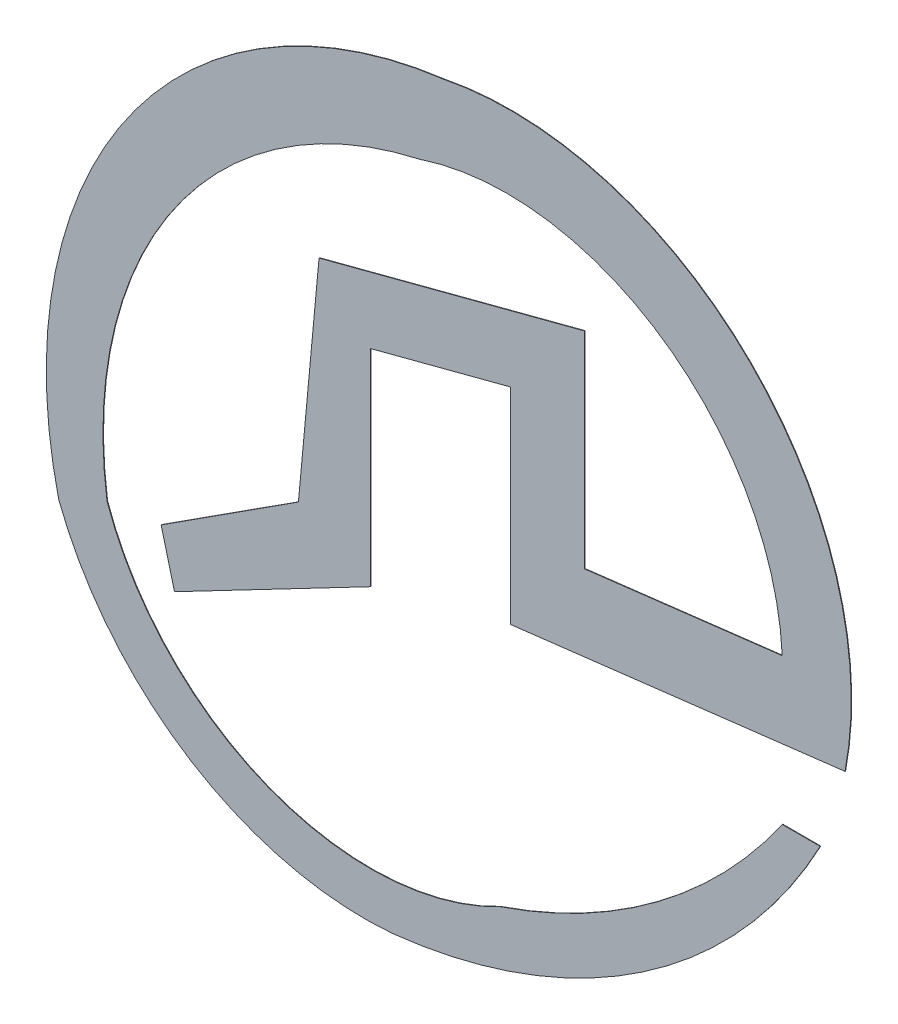
ISO-10303-21;
HEADER;
FILE_DESCRIPTION(('STEP AP214'),'2;1');
FILE_NAME('part.step','',(''),(''),'','','');
FILE_SCHEMA(('AUTOMOTIVE_DESIGN { 1 0 10303 214 1 1 1 1 }'));
ENDSEC;
DATA;
#1=APPLICATION_CONTEXT('core data for automotive mechanical design processes');
#2=APPLICATION_PROTOCOL_DEFINITION('international standard','automotive_design',2000,#1);
#3=PRODUCT_CONTEXT('',#1,'mechanical');
#4=PRODUCT('Part','Part','',(#3));
#5=PRODUCT_RELATED_PRODUCT_CATEGORY('part','',(#4));
#6=PRODUCT_DEFINITION_FORMATION('','',#4);
#7=PRODUCT_DEFINITION_CONTEXT('part definition',#1,'design');
#8=PRODUCT_DEFINITION('design','',#6,#7);
#9=PRODUCT_DEFINITION_SHAPE('','',#8);
#10=(LENGTH_UNIT() NAMED_UNIT(*) SI_UNIT(.MILLI.,.METRE.));
#11=(NAMED_UNIT(*) PLANE_ANGLE_UNIT() SI_UNIT($,.RADIAN.));
#12=(NAMED_UNIT(*) SI_UNIT($,.STERADIAN.) SOLID_ANGLE_UNIT());
#13=UNCERTAINTY_MEASURE_WITH_UNIT(LENGTH_MEASURE(1.E-05),#10,'distance_accuracy_value','');
#14=(GEOMETRIC_REPRESENTATION_CONTEXT(3) GLOBAL_UNCERTAINTY_ASSIGNED_CONTEXT((#13)) GLOBAL_UNIT_ASSIGNED_CONTEXT((#10,
#11,#12)) REPRESENTATION_CONTEXT('',''));
#15=CARTESIAN_POINT('',(0.,0.,0.));
#16=DIRECTION('',(0.,0.,1.));
#17=DIRECTION('',(1.,0.,0.));
#18=AXIS2_PLACEMENT_3D('',#15,#16,#17);
#19=CARTESIAN_POINT('',(-8.12755086725817,5.06390768085549,0.));
#20=DIRECTION('',(0.,0.,1.));
#21=DIRECTION('',(-0.823009518769598,0.56802758032919,0.));
#22=AXIS2_PLACEMENT_3D('',#19,#20,#21);
#23=CYLINDRICAL_SURFACE('',#22,0.740215120586796);
#24=DIRECTION('',(0.,0.,1.));
#25=VECTOR('',#24,1.);
#26=CARTESIAN_POINT('',(-8.86017256024353,4.95815381703683,0.));
#27=LINE('',#26,#25);
#28=CARTESIAN_POINT('',(-8.86017256024353,4.95815381703683,0.));
#29=VERTEX_POINT('',#28);
#30=CARTESIAN_POINT('',(-8.86017256024353,4.95815381703683,0.001));
#31=VERTEX_POINT('',#30);
#32=EDGE_CURVE('E11',#29,#31,#27,.T.);
#33=ORIENTED_EDGE('',*,*,#32,.F.);
#34=CARTESIAN_POINT('',(-8.12755086725852,5.06390768085558,0.));
#35=DIRECTION('',(0.,0.,-1.));
#36=DIRECTION('',(-0.217470441221157,0.976066907130385,0.));
#37=AXIS2_PLACEMENT_3D('',#34,#35,#36);
#38=CIRCLE('',#37,0.740215120586452);
#39=CARTESIAN_POINT('',(-8.28852577613103,5.78640716421755,0.));
#40=VERTEX_POINT('',#39);
#41=EDGE_CURVE('E24',#29,#40,#38,.T.);
#42=ORIENTED_EDGE('',*,*,#41,.T.);
#43=DIRECTION('',(0.,0.,1.));
#44=VECTOR('',#43,1.);
#45=CARTESIAN_POINT('',(-8.28852577613103,5.78640716421755,0.));
#46=LINE('',#45,#44);
#47=CARTESIAN_POINT('',(-8.28852577613103,5.78640716421755,0.001));
#48=VERTEX_POINT('',#47);
#49=EDGE_CURVE('E328',#40,#48,#46,.T.);
#50=ORIENTED_EDGE('',*,*,#49,.T.);
#51=CARTESIAN_POINT('',(-8.12755086725852,5.06390768085558,0.001));
#52=DIRECTION('',(0.,0.,-1.));
#53=DIRECTION('',(-0.217470441221157,0.976066907130385,0.));
#54=AXIS2_PLACEMENT_3D('',#51,#52,#53);
#55=CIRCLE('',#54,0.740215120586452);
#56=EDGE_CURVE('E37',#31,#48,#55,.T.);
#57=ORIENTED_EDGE('',*,*,#56,.F.);
#58=EDGE_LOOP('',(#33,#42,#50,#57));
#59=FACE_BOUND('',#58,.T.);
#60=ADVANCED_FACE('F17',(#59),#23,.F.);
#61=CARTESIAN_POINT('',(-8.37801070213537,5.12812845671001,0.));
#62=DIRECTION('',(0.,0.,1.));
#63=DIRECTION('',(-0.365842136993649,-0.930676920740984,0.));
#64=AXIS2_PLACEMENT_3D('',#61,#62,#63);
#65=CYLINDRICAL_SURFACE('',#64,0.511244985839821);
#66=DIRECTION('',(0.,0.,1.));
#67=VECTOR('',#66,1.);
#68=CARTESIAN_POINT('',(-8.14066059665703,4.67531904539405,0.));
#69=LINE('',#68,#67);
#70=CARTESIAN_POINT('',(-8.14066059665703,4.67531904539405,0.));
#71=VERTEX_POINT('',#70);
#72=CARTESIAN_POINT('',(-8.14066059665703,4.67531904539405,0.001));
#73=VERTEX_POINT('',#72);
#74=EDGE_CURVE('E324',#71,#73,#69,.T.);
#75=ORIENTED_EDGE('',*,*,#74,.F.);
#76=CARTESIAN_POINT('',(-8.37801070213478,5.12812845671054,0.));
#77=DIRECTION('',(0.,0.,-1.));
#78=DIRECTION('',(-0.943113128661843,-0.332471993626034,0.));
#79=AXIS2_PLACEMENT_3D('',#76,#77,#78);
#80=CIRCLE('',#79,0.511244985840538);
#81=EDGE_CURVE('E321',#71,#29,#80,.T.);
#82=ORIENTED_EDGE('',*,*,#81,.T.);
#83=ORIENTED_EDGE('',*,*,#32,.T.);
#84=CARTESIAN_POINT('',(-8.37801070213478,5.12812845671054,0.001));
#85=DIRECTION('',(0.,0.,-1.));
#86=DIRECTION('',(-0.943113128661843,-0.332471993626034,0.));
#87=AXIS2_PLACEMENT_3D('',#84,#85,#86);
#88=CIRCLE('',#87,0.511244985840538);
#89=EDGE_CURVE('E319',#73,#31,#88,.T.);
#90=ORIENTED_EDGE('',*,*,#89,.F.);
#91=EDGE_LOOP('',(#75,#82,#83,#90));
#92=FACE_BOUND('',#91,.T.);
#93=ADVANCED_FACE('F379',(#92),#65,.F.);
#94=CARTESIAN_POINT('',(-8.47218859026643,5.65324933373102,0.));
#95=DIRECTION('',(0.,0.,1.));
#96=DIRECTION('',(0.601295969111747,-0.799026380997502,0.));
#97=AXIS2_PLACEMENT_3D('',#94,#95,#96);
#98=CYLINDRICAL_SURFACE('',#97,1.03259791758141);
#99=DIRECTION('',(0.,0.,1.));
#100=VECTOR('',#99,1.);
#101=CARTESIAN_POINT('',(-7.62428831571753,5.06390768085605,0.));
#102=LINE('',#101,#100);
#103=CARTESIAN_POINT('',(-7.62428831571753,5.06390768085605,0.));
#104=VERTEX_POINT('',#103);
#105=CARTESIAN_POINT('',(-7.62428831571753,5.06390768085605,0.001));
#106=VERTEX_POINT('',#105);
#107=EDGE_CURVE('E316',#104,#106,#102,.T.);
#108=ORIENTED_EDGE('',*,*,#107,.F.);
#109=CARTESIAN_POINT('',(-8.47218859026663,5.65324933373129,0.));
#110=DIRECTION('',(0.,0.,-1.));
#111=DIRECTION('',(0.321062039700811,-0.947058164350614,0.));
#112=AXIS2_PLACEMENT_3D('',#109,#110,#111);
#113=CIRCLE('',#112,1.03259791758175);
#114=EDGE_CURVE('E313',#104,#71,#113,.T.);
#115=ORIENTED_EDGE('',*,*,#114,.T.);
#116=ORIENTED_EDGE('',*,*,#74,.T.);
#117=CARTESIAN_POINT('',(-8.47218859026663,5.65324933373129,0.000999999999999997));
#118=DIRECTION('',(0.,0.,-1.));
#119=DIRECTION('',(0.321062039700811,-0.947058164350614,0.));
#120=AXIS2_PLACEMENT_3D('',#117,#118,#119);
#121=CIRCLE('',#120,1.03259791758175);
#122=EDGE_CURVE('E310',#106,#73,#121,.T.);
#123=ORIENTED_EDGE('',*,*,#122,.F.);
#124=EDGE_LOOP('',(#108,#115,#116,#123));
#125=FACE_BOUND('',#124,.T.);
#126=ADVANCED_FACE('F376',(#125),#98,.F.);
#127=CARTESIAN_POINT('',(-7.58951099048478,5.06390768085605,0.));
#128=DIRECTION('',(0.,1.,0.));
#129=DIRECTION('',(0.,0.,1.));
#130=AXIS2_PLACEMENT_3D('',#127,#128,#129);
#131=PLANE('',#130);
#132=DIRECTION('',(-1.,0.,0.));
#133=VECTOR('',#132,1.);
#134=CARTESIAN_POINT('',(-7.55473366525203,5.06390768085605,0.));
#135=LINE('',#134,#133);
#136=CARTESIAN_POINT('',(-7.55473366525203,5.06390768085605,0.));
#137=VERTEX_POINT('',#136);
#138=EDGE_CURVE('E307',#137,#104,#135,.T.);
#139=ORIENTED_EDGE('',*,*,#138,.T.);
#140=ORIENTED_EDGE('',*,*,#107,.T.);
#141=DIRECTION('',(-1.,0.,0.));
#142=VECTOR('',#141,1.);
#143=CARTESIAN_POINT('',(-7.55473366525203,5.06390768085605,0.001));
#144=LINE('',#143,#142);
#145=CARTESIAN_POINT('',(-7.55473366525203,5.06390768085605,0.001));
#146=VERTEX_POINT('',#145);
#147=EDGE_CURVE('E304',#146,#106,#144,.T.);
#148=ORIENTED_EDGE('',*,*,#147,.F.);
#149=DIRECTION('',(0.,0.,1.));
#150=VECTOR('',#149,1.);
#151=CARTESIAN_POINT('',(-7.55473366525203,5.06390768085605,0.));
#152=LINE('',#151,#150);
#153=EDGE_CURVE('E301',#137,#146,#152,.T.);
#154=ORIENTED_EDGE('',*,*,#153,.F.);
#155=EDGE_LOOP('',(#139,#140,#148,#154));
#156=FACE_BOUND('',#155,.T.);
#157=ADVANCED_FACE('F373',(#156),#131,.T.);
#158=CARTESIAN_POINT('',(-8.4458952838809,5.5378732251417,0.));
#159=DIRECTION('',(0.,0.,1.));
#160=DIRECTION('',(0.560614155361485,-0.828077151483078,0.));
#161=AXIS2_PLACEMENT_3D('',#158,#159,#160);
#162=CYLINDRICAL_SURFACE('',#161,1.00936235697931);
#163=CARTESIAN_POINT('',(-8.4458952838811,5.53787322514245,0.));
#164=DIRECTION('',(0.,0.,1.));
#165=DIRECTION('',(0.882895634522556,-0.469569269161658,0.));
#166=AXIS2_PLACEMENT_3D('',#163,#164,#165);
#167=CIRCLE('',#166,1.00936235698004);
#168=CARTESIAN_POINT('',(-8.33683395507003,4.53442018974605,0.));
#169=VERTEX_POINT('',#168);
#170=EDGE_CURVE('E298',#169,#137,#167,.T.);
#171=ORIENTED_EDGE('',*,*,#170,.T.);
#172=ORIENTED_EDGE('',*,*,#153,.T.);
#173=CARTESIAN_POINT('',(-8.4458952838811,5.53787322514245,0.001));
#174=DIRECTION('',(0.,0.,1.));
#175=DIRECTION('',(0.882895634522556,-0.469569269161658,0.));
#176=AXIS2_PLACEMENT_3D('',#173,#174,#175);
#177=CIRCLE('',#176,1.00936235698004);
#178=CARTESIAN_POINT('',(-8.33683395507003,4.53442018974605,0.001));
#179=VERTEX_POINT('',#178);
#180=EDGE_CURVE('E295',#179,#146,#177,.T.);
#181=ORIENTED_EDGE('',*,*,#180,.F.);
#182=DIRECTION('',(0.,0.,1.));
#183=VECTOR('',#182,1.);
#184=CARTESIAN_POINT('',(-8.33683395507003,4.53442018974605,0.));
#185=LINE('',#184,#183);
#186=EDGE_CURVE('E292',#169,#179,#185,.T.);
#187=ORIENTED_EDGE('',*,*,#186,.F.);
#188=EDGE_LOOP('',(#171,#172,#181,#187));
#189=FACE_BOUND('',#188,.T.);
#190=ADVANCED_FACE('F370',(#189),#162,.T.);
#191=CARTESIAN_POINT('',(-8.38869511225856,5.13218509250382,0.));
#192=DIRECTION('',(0.,0.,1.));
#193=DIRECTION('',(-0.529998941108192,-0.847998303314456,0.));
#194=AXIS2_PLACEMENT_3D('',#191,#192,#193);
#195=CYLINDRICAL_SURFACE('',#194,0.600010382072117);
#196=CARTESIAN_POINT('',(-8.38869511225918,5.1321850925034,0.));
#197=DIRECTION('',(0.,0.,1.));
#198=DIRECTION('',(0.0864337663793568,-0.996257599232989,0.));
#199=AXIS2_PLACEMENT_3D('',#196,#197,#198);
#200=CIRCLE('',#199,0.600010382071433);
#201=CARTESIAN_POINT('',(-8.94873755496603,4.91685994078988,0.));
#202=VERTEX_POINT('',#201);
#203=EDGE_CURVE('E289',#202,#169,#200,.T.);
#204=ORIENTED_EDGE('',*,*,#203,.T.);
#205=ORIENTED_EDGE('',*,*,#186,.T.);
#206=CARTESIAN_POINT('',(-8.38869511225918,5.1321850925034,0.001));
#207=DIRECTION('',(0.,0.,1.));
#208=DIRECTION('',(0.0864337663793568,-0.996257599232989,0.));
#209=AXIS2_PLACEMENT_3D('',#206,#207,#208);
#210=CIRCLE('',#209,0.600010382071433);
#211=CARTESIAN_POINT('',(-8.94873755496603,4.91685994078988,0.001));
#212=VERTEX_POINT('',#211);
#213=EDGE_CURVE('E286',#212,#179,#210,.T.);
#214=ORIENTED_EDGE('',*,*,#213,.F.);
#215=DIRECTION('',(0.,0.,1.));
#216=VECTOR('',#215,1.);
#217=CARTESIAN_POINT('',(-8.94873755496603,4.91685994078988,0.));
#218=LINE('',#217,#216);
#219=EDGE_CURVE('E283',#202,#212,#218,.T.);
#220=ORIENTED_EDGE('',*,*,#219,.F.);
#221=EDGE_LOOP('',(#204,#205,#214,#220));
#222=FACE_BOUND('',#221,.T.);
#223=ADVANCED_FACE('F367',(#222),#195,.T.);
#224=CARTESIAN_POINT('',(-8.13946799928107,5.1099864372306,0.));
#225=DIRECTION('',(0.,0.,1.));
#226=DIRECTION('',(-0.822426173046468,0.568871857177116,0.));
#227=AXIS2_PLACEMENT_3D('',#224,#225,#226);
#228=CYLINDRICAL_SURFACE('',#227,0.831994625815771);
#229=CARTESIAN_POINT('',(-8.13946799928115,5.10998643723086,0.));
#230=DIRECTION('',(0.,0.,1.));
#231=DIRECTION('',(-0.972686037354625,-0.232124692213813,0.));
#232=AXIS2_PLACEMENT_3D('',#229,#230,#231);
#233=CIRCLE('',#232,0.831994625815558);
#234=CARTESIAN_POINT('',(-8.24424327876903,5.93535738304505,0.));
#235=VERTEX_POINT('',#234);
#236=EDGE_CURVE('E280',#235,#202,#233,.T.);
#237=ORIENTED_EDGE('',*,*,#236,.T.);
#238=ORIENTED_EDGE('',*,*,#219,.T.);
#239=CARTESIAN_POINT('',(-8.13946799928115,5.10998643723086,0.001));
#240=DIRECTION('',(0.,0.,1.));
#241=DIRECTION('',(-0.972686037354625,-0.232124692213813,0.));
#242=AXIS2_PLACEMENT_3D('',#239,#240,#241);
#243=CIRCLE('',#242,0.831994625815558);
#244=CARTESIAN_POINT('',(-8.24424327876903,5.93535738304505,0.001));
#245=VERTEX_POINT('',#244);
#246=EDGE_CURVE('E277',#245,#212,#243,.T.);
#247=ORIENTED_EDGE('',*,*,#246,.F.);
#248=DIRECTION('',(0.,0.,1.));
#249=VECTOR('',#248,1.);
#250=CARTESIAN_POINT('',(-8.24424327876903,5.93535738304505,0.));
#251=LINE('',#250,#249);
#252=EDGE_CURVE('E274',#235,#245,#251,.T.);
#253=ORIENTED_EDGE('',*,*,#252,.F.);
#254=EDGE_LOOP('',(#237,#238,#247,#253));
#255=FACE_BOUND('',#254,.T.);
#256=ADVANCED_FACE('F364',(#255),#228,.T.);
#257=CARTESIAN_POINT('',(-8.12187614964439,5.32367465248673,0.));
#258=DIRECTION('',(0.,0.,1.));
#259=DIRECTION('',(0.704694420172105,0.709510940139968,0.));
#260=AXIS2_PLACEMENT_3D('',#257,#258,#259);
#261=CYLINDRICAL_SURFACE('',#260,0.623802434391777);
#262=CARTESIAN_POINT('',(-8.1218761496447,5.32367465248682,0.));
#263=DIRECTION('',(0.,0.,1.));
#264=DIRECTION('',(-0.196163276027629,0.980571246334558,0.));
#265=AXIS2_PLACEMENT_3D('',#262,#263,#264);
#266=CIRCLE('',#265,0.623802434391929);
#267=CARTESIAN_POINT('',(-7.50937409981403,5.20547686863905,0.));
#268=VERTEX_POINT('',#267);
#269=EDGE_CURVE('E271',#268,#235,#266,.T.);
#270=ORIENTED_EDGE('',*,*,#269,.T.);
#271=ORIENTED_EDGE('',*,*,#252,.T.);
#272=CARTESIAN_POINT('',(-8.1218761496447,5.32367465248682,0.001));
#273=DIRECTION('',(0.,0.,1.));
#274=DIRECTION('',(-0.196163276027629,0.980571246334558,0.));
#275=AXIS2_PLACEMENT_3D('',#272,#273,#274);
#276=CIRCLE('',#275,0.623802434391929);
#277=CARTESIAN_POINT('',(-7.50937409981403,5.20547686863905,0.001));
#278=VERTEX_POINT('',#277);
#279=EDGE_CURVE('E268',#278,#245,#276,.T.);
#280=ORIENTED_EDGE('',*,*,#279,.F.);
#281=DIRECTION('',(0.,0.,1.));
#282=VECTOR('',#281,1.);
#283=CARTESIAN_POINT('',(-7.50937409981403,5.20547686863905,0.));
#284=LINE('',#283,#282);
#285=EDGE_CURVE('E265',#268,#278,#284,.T.);
#286=ORIENTED_EDGE('',*,*,#285,.F.);
#287=EDGE_LOOP('',(#270,#271,#280,#286));
#288=FACE_BOUND('',#287,.T.);
#289=ADVANCED_FACE('F361',(#288),#261,.T.);
#290=CARTESIAN_POINT('',(-7.81562512472928,5.16883098057062,0.));
#291=DIRECTION('',(0.118812064313301,-0.992916760546226,0.));
#292=DIRECTION('',(0.,0.,-1.));
#293=AXIS2_PLACEMENT_3D('',#290,#291,#292);
#294=PLANE('',#293);
#295=DIRECTION('',(0.992916760546226,0.118812064313301,0.));
#296=VECTOR('',#295,1.);
#297=CARTESIAN_POINT('',(-8.12187614964453,5.13218509250219,0.));
#298=LINE('',#297,#296);
#299=CARTESIAN_POINT('',(-8.12187614964453,5.13218509250219,0.));
#300=VERTEX_POINT('',#299);
#301=EDGE_CURVE('E262',#300,#268,#298,.T.);
#302=ORIENTED_EDGE('',*,*,#301,.T.);
#303=ORIENTED_EDGE('',*,*,#285,.T.);
#304=DIRECTION('',(0.992916760546226,0.118812064313301,0.));
#305=VECTOR('',#304,1.);
#306=CARTESIAN_POINT('',(-8.12187614964453,5.13218509250219,0.001));
#307=LINE('',#306,#305);
#308=CARTESIAN_POINT('',(-8.12187614964453,5.13218509250219,0.001));
#309=VERTEX_POINT('',#308);
#310=EDGE_CURVE('E259',#309,#278,#307,.T.);
#311=ORIENTED_EDGE('',*,*,#310,.F.);
#312=DIRECTION('',(0.,0.,1.));
#313=VECTOR('',#312,1.);
#314=CARTESIAN_POINT('',(-8.12187614964453,5.13218509250219,0.));
#315=LINE('',#314,#313);
#316=EDGE_CURVE('E256',#300,#309,#315,.T.);
#317=ORIENTED_EDGE('',*,*,#316,.F.);
#318=EDGE_LOOP('',(#302,#303,#311,#317));
#319=FACE_BOUND('',#318,.T.);
#320=ADVANCED_FACE('F358',(#319),#294,.T.);
#321=CARTESIAN_POINT('',(-8.12187614964453,5.32041011350637,0.));
#322=DIRECTION('',(-1.,0.,0.));
#323=DIRECTION('',(0.,0.,1.));
#324=AXIS2_PLACEMENT_3D('',#321,#322,#323);
#325=PLANE('',#324);
#326=DIRECTION('',(0.,-1.,0.));
#327=VECTOR('',#326,1.);
#328=CARTESIAN_POINT('',(-8.12187614964453,5.50863513451055,0.));
#329=LINE('',#328,#327);
#330=CARTESIAN_POINT('',(-8.12187614964453,5.50863513451055,0.));
#331=VERTEX_POINT('',#330);
#332=EDGE_CURVE('E253',#331,#300,#329,.T.);
#333=ORIENTED_EDGE('',*,*,#332,.T.);
#334=ORIENTED_EDGE('',*,*,#316,.T.);
#335=DIRECTION('',(0.,-1.,0.));
#336=VECTOR('',#335,1.);
#337=CARTESIAN_POINT('',(-8.12187614964453,5.50863513451055,0.001));
#338=LINE('',#337,#336);
#339=CARTESIAN_POINT('',(-8.12187614964453,5.50863513451055,0.001));
#340=VERTEX_POINT('',#339);
#341=EDGE_CURVE('E250',#340,#309,#338,.T.);
#342=ORIENTED_EDGE('',*,*,#341,.F.);
#343=DIRECTION('',(0.,0.,1.));
#344=VECTOR('',#343,1.);
#345=CARTESIAN_POINT('',(-8.12187614964453,5.50863513451055,0.));
#346=LINE('',#345,#344);
#347=EDGE_CURVE('E247',#331,#340,#346,.T.);
#348=ORIENTED_EDGE('',*,*,#347,.F.);
#349=EDGE_LOOP('',(#333,#334,#342,#348));
#350=FACE_BOUND('',#349,.T.);
#351=ADVANCED_FACE('F355',(#350),#325,.T.);
#352=CARTESIAN_POINT('',(-8.24994342588978,5.4750573211658,0.));
#353=DIRECTION('',(0.253616553348339,-0.967304835027567,0.));
#354=DIRECTION('',(0.,0.,-1.));
#355=AXIS2_PLACEMENT_3D('',#352,#353,#354);
#356=PLANE('',#355);
#357=DIRECTION('',(0.967304835027567,0.253616553348339,0.));
#358=VECTOR('',#357,1.);
#359=CARTESIAN_POINT('',(-8.37801070213503,5.44147950782104,0.));
#360=LINE('',#359,#358);
#361=CARTESIAN_POINT('',(-8.37801070213503,5.44147950782104,0.));
#362=VERTEX_POINT('',#361);
#363=EDGE_CURVE('E244',#362,#331,#360,.T.);
#364=ORIENTED_EDGE('',*,*,#363,.T.);
#365=ORIENTED_EDGE('',*,*,#347,.T.);
#366=DIRECTION('',(0.967304835027567,0.253616553348339,0.));
#367=VECTOR('',#366,1.);
#368=CARTESIAN_POINT('',(-8.37801070213503,5.44147950782104,0.001));
#369=LINE('',#368,#367);
#370=CARTESIAN_POINT('',(-8.37801070213503,5.44147950782104,0.001));
#371=VERTEX_POINT('',#370);
#372=EDGE_CURVE('E241',#371,#340,#369,.T.);
#373=ORIENTED_EDGE('',*,*,#372,.F.);
#374=DIRECTION('',(0.,0.,1.));
#375=VECTOR('',#374,1.);
#376=CARTESIAN_POINT('',(-8.37801070213503,5.44147950782104,0.));
#377=LINE('',#376,#375);
#378=EDGE_CURVE('E238',#362,#371,#377,.T.);
#379=ORIENTED_EDGE('',*,*,#378,.F.);
#380=EDGE_LOOP('',(#364,#365,#373,#379));
#381=FACE_BOUND('',#380,.T.);
#382=ADVANCED_FACE('F352',(#381),#356,.T.);
#383=CARTESIAN_POINT('',(-8.37801070213428,5.25269359433855,0.));
#384=DIRECTION('',(1.,3.97288668544043E-12,0.));
#385=DIRECTION('',(0.,0.,-1.));
#386=AXIS2_PLACEMENT_3D('',#383,#384,#385);
#387=PLANE('',#386);
#388=DIRECTION('',(-3.97288668544043E-12,1.,0.));
#389=VECTOR('',#388,1.);
#390=CARTESIAN_POINT('',(-8.37801070213353,5.06390768085605,0.));
#391=LINE('',#390,#389);
#392=CARTESIAN_POINT('',(-8.37801070213353,5.06390768085605,0.));
#393=VERTEX_POINT('',#392);
#394=EDGE_CURVE('E235',#393,#362,#391,.T.);
#395=ORIENTED_EDGE('',*,*,#394,.T.);
#396=ORIENTED_EDGE('',*,*,#378,.T.);
#397=DIRECTION('',(-3.97288668544043E-12,1.,0.));
#398=VECTOR('',#397,1.);
#399=CARTESIAN_POINT('',(-8.37801070213353,5.06390768085605,0.001));
#400=LINE('',#399,#398);
#401=CARTESIAN_POINT('',(-8.37801070213353,5.06390768085605,0.001));
#402=VERTEX_POINT('',#401);
#403=EDGE_CURVE('E232',#402,#371,#400,.T.);
#404=ORIENTED_EDGE('',*,*,#403,.F.);
#405=DIRECTION('',(0.,0.,1.));
#406=VECTOR('',#405,1.);
#407=CARTESIAN_POINT('',(-8.37801070213353,5.06390768085605,0.));
#408=LINE('',#407,#406);
#409=EDGE_CURVE('E229',#393,#402,#408,.T.);
#410=ORIENTED_EDGE('',*,*,#409,.F.);
#411=EDGE_LOOP('',(#395,#396,#404,#410));
#412=FACE_BOUND('',#411,.T.);
#413=ADVANCED_FACE('F349',(#412),#387,.T.);
#414=CARTESIAN_POINT('',(-8.55738282978678,4.9702554028733,0.));
#415=DIRECTION('',(0.462825552130016,-0.886449382816383,0.));
#416=DIRECTION('',(0.,0.,-1.));
#417=AXIS2_PLACEMENT_3D('',#414,#415,#416);
#418=PLANE('',#417);
#419=DIRECTION('',(0.886449382816383,0.462825552130016,0.));
#420=VECTOR('',#419,1.);
#421=CARTESIAN_POINT('',(-8.73675495743853,4.87660312489055,0.));
#422=LINE('',#421,#420);
#423=CARTESIAN_POINT('',(-8.73675495743853,4.87660312489055,0.));
#424=VERTEX_POINT('',#423);
#425=EDGE_CURVE('E226',#424,#393,#422,.T.);
#426=ORIENTED_EDGE('',*,*,#425,.T.);
#427=ORIENTED_EDGE('',*,*,#409,.T.);
#428=DIRECTION('',(0.886449382816383,0.462825552130016,0.));
#429=VECTOR('',#428,1.);
#430=CARTESIAN_POINT('',(-8.73675495743853,4.87660312489055,0.001));
#431=LINE('',#430,#429);
#432=CARTESIAN_POINT('',(-8.73675495743853,4.87660312489055,0.001));
#433=VERTEX_POINT('',#432);
#434=EDGE_CURVE('E223',#433,#402,#431,.T.);
#435=ORIENTED_EDGE('',*,*,#434,.F.);
#436=DIRECTION('',(0.,0.,1.));
#437=VECTOR('',#436,1.);
#438=CARTESIAN_POINT('',(-8.73675495743853,4.87660312489055,0.));
#439=LINE('',#438,#437);
#440=EDGE_CURVE('E220',#424,#433,#439,.T.);
#441=ORIENTED_EDGE('',*,*,#440,.F.);
#442=EDGE_LOOP('',(#426,#427,#435,#441));
#443=FACE_BOUND('',#442,.T.);
#444=ADVANCED_FACE('F346',(#443),#418,.T.);
#445=CARTESIAN_POINT('',(-8.74903224950553,4.9234292638819,0.));
#446=DIRECTION('',(-0.967304835028313,-0.253616553345494,0.));
#447=DIRECTION('',(0.,0.,1.));
#448=AXIS2_PLACEMENT_3D('',#445,#446,#447);
#449=PLANE('',#448);
#450=DIRECTION('',(0.253616553345494,-0.967304835028313,0.));
#451=VECTOR('',#450,1.);
#452=CARTESIAN_POINT('',(-8.76130954157253,4.97025540287325,0.));
#453=LINE('',#452,#451);
#454=CARTESIAN_POINT('',(-8.76130954157253,4.97025540287325,0.));
#455=VERTEX_POINT('',#454);
#456=EDGE_CURVE('E217',#455,#424,#453,.T.);
#457=ORIENTED_EDGE('',*,*,#456,.T.);
#458=ORIENTED_EDGE('',*,*,#440,.T.);
#459=DIRECTION('',(0.253616553345494,-0.967304835028313,0.));
#460=VECTOR('',#459,1.);
#461=CARTESIAN_POINT('',(-8.76130954157253,4.97025540287325,0.001));
#462=LINE('',#461,#460);
#463=CARTESIAN_POINT('',(-8.76130954157253,4.97025540287325,0.001));
#464=VERTEX_POINT('',#463);
#465=EDGE_CURVE('E214',#464,#433,#462,.T.);
#466=ORIENTED_EDGE('',*,*,#465,.F.);
#467=DIRECTION('',(0.,0.,1.));
#468=VECTOR('',#467,1.);
#469=CARTESIAN_POINT('',(-8.76130954157253,4.97025540287325,0.));
#470=LINE('',#469,#468);
#471=EDGE_CURVE('E211',#455,#464,#470,.T.);
#472=ORIENTED_EDGE('',*,*,#471,.F.);
#473=EDGE_LOOP('',(#457,#458,#466,#472));
#474=FACE_BOUND('',#473,.T.);
#475=ADVANCED_FACE('F343',(#474),#449,.T.);
#476=CARTESIAN_POINT('',(-8.63562390225378,5.05122024768772,0.));
#477=DIRECTION('',(-0.541547413830411,0.840670207973135,0.));
#478=DIRECTION('',(0.,0.,1.));
#479=AXIS2_PLACEMENT_3D('',#476,#477,#478);
#480=PLANE('',#479);
#481=DIRECTION('',(-0.840670207973135,-0.541547413830411,0.));
#482=VECTOR('',#481,1.);
#483=CARTESIAN_POINT('',(-8.50993826293503,5.13218509250219,0.));
#484=LINE('',#483,#482);
#485=CARTESIAN_POINT('',(-8.50993826293503,5.13218509250219,0.));
#486=VERTEX_POINT('',#485);
#487=EDGE_CURVE('E208',#486,#455,#484,.T.);
#488=ORIENTED_EDGE('',*,*,#487,.T.);
#489=ORIENTED_EDGE('',*,*,#471,.T.);
#490=DIRECTION('',(-0.840670207973135,-0.541547413830411,0.));
#491=VECTOR('',#490,1.);
#492=CARTESIAN_POINT('',(-8.50993826293503,5.13218509250219,0.001));
#493=LINE('',#492,#491);
#494=CARTESIAN_POINT('',(-8.50993826293503,5.13218509250219,0.001));
#495=VERTEX_POINT('',#494);
#496=EDGE_CURVE('E205',#495,#464,#493,.T.);
#497=ORIENTED_EDGE('',*,*,#496,.F.);
#498=DIRECTION('',(0.,0.,1.));
#499=VECTOR('',#498,1.);
#500=CARTESIAN_POINT('',(-8.50993826293503,5.13218509250219,0.));
#501=LINE('',#500,#499);
#502=EDGE_CURVE('E202',#486,#495,#501,.T.);
#503=ORIENTED_EDGE('',*,*,#502,.F.);
#504=EDGE_LOOP('',(#488,#489,#497,#503));
#505=FACE_BOUND('',#504,.T.);
#506=ADVANCED_FACE('F340',(#505),#480,.T.);
#507=CARTESIAN_POINT('',(-8.49106342660278,5.33502915882212,0.));
#508=DIRECTION('',(-0.995698671025003,0.0926507232515939,0.));
#509=DIRECTION('',(0.,0.,1.));
#510=AXIS2_PLACEMENT_3D('',#507,#508,#509);
#511=PLANE('',#510);
#512=DIRECTION('',(-0.0926507232515939,-0.995698671025003,0.));
#513=VECTOR('',#512,1.);
#514=CARTESIAN_POINT('',(-8.47218859027053,5.53787322514205,0.));
#515=LINE('',#514,#513);
#516=CARTESIAN_POINT('',(-8.47218859027053,5.53787322514205,0.));
#517=VERTEX_POINT('',#516);
#518=EDGE_CURVE('E199',#517,#486,#515,.T.);
#519=ORIENTED_EDGE('',*,*,#518,.T.);
#520=ORIENTED_EDGE('',*,*,#502,.T.);
#521=DIRECTION('',(-0.0926507232515939,-0.995698671025003,0.));
#522=VECTOR('',#521,1.);
#523=CARTESIAN_POINT('',(-8.47218859027053,5.53787322514205,0.001));
#524=LINE('',#523,#522);
#525=CARTESIAN_POINT('',(-8.47218859027053,5.53787322514205,0.001));
#526=VERTEX_POINT('',#525);
#527=EDGE_CURVE('E196',#526,#495,#524,.T.);
#528=ORIENTED_EDGE('',*,*,#527,.F.);
#529=DIRECTION('',(0.,0.,1.));
#530=VECTOR('',#529,1.);
#531=CARTESIAN_POINT('',(-8.47218859027053,5.53787322514205,0.));
#532=LINE('',#531,#530);
#533=EDGE_CURVE('E193',#517,#526,#532,.T.);
#534=ORIENTED_EDGE('',*,*,#533,.F.);
#535=EDGE_LOOP('',(#519,#520,#528,#534));
#536=FACE_BOUND('',#535,.T.);
#537=ADVANCED_FACE('F337',(#536),#511,.T.);
#538=CARTESIAN_POINT('',(-8.22943445470428,5.60152065555305,0.));
#539=DIRECTION('',(-0.253616553349392,0.967304835027291,0.));
#540=DIRECTION('',(0.,0.,1.));
#541=AXIS2_PLACEMENT_3D('',#538,#539,#540);
#542=PLANE('',#541);
#543=DIRECTION('',(-0.967304835027291,-0.253616553349392,0.));
#544=VECTOR('',#543,1.);
#545=CARTESIAN_POINT('',(-7.98668031913803,5.66516808596405,0.));
#546=LINE('',#545,#544);
#547=CARTESIAN_POINT('',(-7.98668031913803,5.66516808596405,0.));
#548=VERTEX_POINT('',#547);
#549=EDGE_CURVE('E190',#548,#517,#546,.T.);
#550=ORIENTED_EDGE('',*,*,#549,.T.);
#551=ORIENTED_EDGE('',*,*,#533,.T.);
#552=DIRECTION('',(-0.967304835027291,-0.253616553349392,0.));
#553=VECTOR('',#552,1.);
#554=CARTESIAN_POINT('',(-7.98668031913803,5.66516808596405,0.001));
#555=LINE('',#554,#553);
#556=CARTESIAN_POINT('',(-7.98668031913803,5.66516808596405,0.001));
#557=VERTEX_POINT('',#556);
#558=EDGE_CURVE('E187',#557,#526,#555,.T.);
#559=ORIENTED_EDGE('',*,*,#558,.F.);
#560=DIRECTION('',(0.,0.,1.));
#561=VECTOR('',#560,1.);
#562=CARTESIAN_POINT('',(-7.98668031913803,5.66516808596405,0.));
#563=LINE('',#562,#561);
#564=EDGE_CURVE('E184',#548,#557,#563,.T.);
#565=ORIENTED_EDGE('',*,*,#564,.F.);
#566=EDGE_LOOP('',(#550,#551,#559,#565));
#567=FACE_BOUND('',#566,.T.);
#568=ADVANCED_FACE('F334',(#567),#542,.T.);
#569=CARTESIAN_POINT('',(-7.98668031913803,5.47663195468355,0.));
#570=DIRECTION('',(1.,0.,0.));
#571=DIRECTION('',(0.,0.,-1.));
#572=AXIS2_PLACEMENT_3D('',#569,#570,#571);
#573=PLANE('',#572);
#574=DIRECTION('',(0.,1.,0.));
#575=VECTOR('',#574,1.);
#576=CARTESIAN_POINT('',(-7.98668031913803,5.28809582340305,0.));
#577=LINE('',#576,#575);
#578=CARTESIAN_POINT('',(-7.98668031913803,5.28809582340305,0.));
#579=VERTEX_POINT('',#578);
#580=EDGE_CURVE('E181',#579,#548,#577,.T.);
#581=ORIENTED_EDGE('',*,*,#580,.T.);
#582=ORIENTED_EDGE('',*,*,#564,.T.);
#583=DIRECTION('',(0.,1.,0.));
#584=VECTOR('',#583,1.);
#585=CARTESIAN_POINT('',(-7.98668031913803,5.28809582340305,0.001));
#586=LINE('',#585,#584);
#587=CARTESIAN_POINT('',(-7.98668031913803,5.28809582340305,0.001));
#588=VERTEX_POINT('',#587);
#589=EDGE_CURVE('E179',#588,#557,#586,.T.);
#590=ORIENTED_EDGE('',*,*,#589,.F.);
#591=DIRECTION('',(0.,0.,1.));
#592=VECTOR('',#591,1.);
#593=CARTESIAN_POINT('',(-7.98668031913803,5.28809582340305,0.));
#594=LINE('',#593,#592);
#595=EDGE_CURVE('E160',#579,#588,#594,.T.);
#596=ORIENTED_EDGE('',*,*,#595,.F.);
#597=EDGE_LOOP('',(#581,#582,#590,#596));
#598=FACE_BOUND('',#597,.T.);
#599=ADVANCED_FACE('F332',(#598),#573,.T.);
#600=CARTESIAN_POINT('',(-7.80548431742778,5.3097776721383,0.));
#601=DIRECTION('',(-0.118812064315186,0.992916760546001,0.));
#602=DIRECTION('',(0.,0.,1.));
#603=AXIS2_PLACEMENT_3D('',#600,#601,#602);
#604=PLANE('',#603);
#605=DIRECTION('',(-0.992916760546001,-0.118812064315186,0.));
#606=VECTOR('',#605,1.);
#607=CARTESIAN_POINT('',(-7.62428831571753,5.33145952087355,0.));
#608=LINE('',#607,#606);
#609=CARTESIAN_POINT('',(-7.62428831571753,5.33145952087355,0.));
#610=VERTEX_POINT('',#609);
#611=EDGE_CURVE('E164',#610,#579,#608,.T.);
#612=ORIENTED_EDGE('',*,*,#611,.T.);
#613=ORIENTED_EDGE('',*,*,#595,.T.);
#614=DIRECTION('',(-0.992916760546001,-0.118812064315186,0.));
#615=VECTOR('',#614,1.);
#616=CARTESIAN_POINT('',(-7.62428831571753,5.33145952087355,0.001));
#617=LINE('',#616,#615);
#618=CARTESIAN_POINT('',(-7.62428831571753,5.33145952087355,0.001));
#619=VERTEX_POINT('',#618);
#620=EDGE_CURVE('E153',#619,#588,#617,.T.);
#621=ORIENTED_EDGE('',*,*,#620,.F.);
#622=DIRECTION('',(0.,0.,1.));
#623=VECTOR('',#622,1.);
#624=CARTESIAN_POINT('',(-7.62428831571753,5.33145952087355,0.));
#625=LINE('',#624,#623);
#626=EDGE_CURVE('E157',#610,#619,#625,.T.);
#627=ORIENTED_EDGE('',*,*,#626,.F.);
#628=EDGE_LOOP('',(#612,#613,#621,#627));
#629=FACE_BOUND('',#628,.T.);
#630=ADVANCED_FACE('F156',(#629),#604,.T.);
#631=CARTESIAN_POINT('',(-8.12844517864949,5.30775241206316,0.));
#632=DIRECTION('',(0.,0.,1.));
#633=DIRECTION('',(0.565080955859335,0.825035461859125,0.));
#634=AXIS2_PLACEMENT_3D('',#631,#632,#633);
#635=CYLINDRICAL_SURFACE('',#634,0.504713948142437);
#636=ORIENTED_EDGE('',*,*,#49,.F.);
#637=CARTESIAN_POINT('',(-8.12844517865011,5.30775241206279,0.));
#638=DIRECTION('',(0.,0.,-1.));
#639=DIRECTION('',(0.998896235753818,0.0469713763568066,0.));
#640=AXIS2_PLACEMENT_3D('',#637,#638,#639);
#641=CIRCLE('',#640,0.504713948143087);
#642=EDGE_CURVE('E170',#40,#610,#641,.T.);
#643=ORIENTED_EDGE('',*,*,#642,.T.);
#644=ORIENTED_EDGE('',*,*,#626,.T.);
#645=CARTESIAN_POINT('',(-8.12844517865011,5.30775241206279,0.001));
#646=DIRECTION('',(0.,0.,-1.));
#647=DIRECTION('',(0.998896235753818,0.0469713763568066,0.));
#648=AXIS2_PLACEMENT_3D('',#645,#646,#647);
#649=CIRCLE('',#648,0.504713948143087);
#650=EDGE_CURVE('E169',#48,#619,#649,.T.);
#651=ORIENTED_EDGE('',*,*,#650,.F.);
#652=EDGE_LOOP('',(#636,#643,#644,#651));
#653=FACE_BOUND('',#652,.T.);
#654=ADVANCED_FACE('F168',(#653),#635,.F.);
#655=CARTESIAN_POINT('',(-8.23476817017528,4.53217471043105,0.001));
#656=DIRECTION('',(0.,0.,1.));
#657=DIRECTION('',(1.,0.,0.));
#658=AXIS2_PLACEMENT_3D('',#655,#656,#657);
#659=PLANE('',#658);
#660=ORIENTED_EDGE('',*,*,#650,.T.);
#661=ORIENTED_EDGE('',*,*,#620,.T.);
#662=ORIENTED_EDGE('',*,*,#589,.T.);
#663=ORIENTED_EDGE('',*,*,#558,.T.);
#664=ORIENTED_EDGE('',*,*,#527,.T.);
#665=ORIENTED_EDGE('',*,*,#496,.T.);
#666=ORIENTED_EDGE('',*,*,#465,.T.);
#667=ORIENTED_EDGE('',*,*,#434,.T.);
#668=ORIENTED_EDGE('',*,*,#403,.T.);
#669=ORIENTED_EDGE('',*,*,#372,.T.);
#670=ORIENTED_EDGE('',*,*,#341,.T.);
#671=ORIENTED_EDGE('',*,*,#310,.T.);
#672=ORIENTED_EDGE('',*,*,#279,.T.);
#673=ORIENTED_EDGE('',*,*,#246,.T.);
#674=ORIENTED_EDGE('',*,*,#213,.T.);
#675=ORIENTED_EDGE('',*,*,#180,.T.);
#676=ORIENTED_EDGE('',*,*,#147,.T.);
#677=ORIENTED_EDGE('',*,*,#122,.T.);
#678=ORIENTED_EDGE('',*,*,#89,.T.);
#679=ORIENTED_EDGE('',*,*,#56,.T.);
#680=EDGE_LOOP('',(#660,#661,#662,#663,#664,#665,#666,#667,#668,#669,#670,#671,#672,#673,#674,
#675,#676,#677,#678,#679));
#681=FACE_BOUND('',#680,.T.);
#682=ADVANCED_FACE('F172',(#681),#659,.T.);
#683=CARTESIAN_POINT('',(-8.23476817017528,4.53217471043105,0.));
#684=DIRECTION('',(0.,0.,1.));
#685=DIRECTION('',(1.,0.,0.));
#686=AXIS2_PLACEMENT_3D('',#683,#684,#685);
#687=PLANE('',#686);
#688=ORIENTED_EDGE('',*,*,#642,.F.);
#689=ORIENTED_EDGE('',*,*,#41,.F.);
#690=ORIENTED_EDGE('',*,*,#81,.F.);
#691=ORIENTED_EDGE('',*,*,#114,.F.);
#692=ORIENTED_EDGE('',*,*,#138,.F.);
#693=ORIENTED_EDGE('',*,*,#170,.F.);
#694=ORIENTED_EDGE('',*,*,#203,.F.);
#695=ORIENTED_EDGE('',*,*,#236,.F.);
#696=ORIENTED_EDGE('',*,*,#269,.F.);
#697=ORIENTED_EDGE('',*,*,#301,.F.);
#698=ORIENTED_EDGE('',*,*,#332,.F.);
#699=ORIENTED_EDGE('',*,*,#363,.F.);
#700=ORIENTED_EDGE('',*,*,#394,.F.);
#701=ORIENTED_EDGE('',*,*,#425,.F.);
#702=ORIENTED_EDGE('',*,*,#456,.F.);
#703=ORIENTED_EDGE('',*,*,#487,.F.);
#704=ORIENTED_EDGE('',*,*,#518,.F.);
#705=ORIENTED_EDGE('',*,*,#549,.F.);
#706=ORIENTED_EDGE('',*,*,#580,.F.);
#707=ORIENTED_EDGE('',*,*,#611,.F.);
#708=EDGE_LOOP('',(#688,#689,#690,#691,#692,#693,#694,#695,#696,#697,#698,#699,#700,#701,#702,
#703,#704,#705,#706,#707));
#709=FACE_BOUND('',#708,.T.);
#710=ADVANCED_FACE('F329',(#709),#687,.F.);
#711=CLOSED_SHELL('',(#60,#93,#126,#157,#190,#223,#256,#289,#320,#351,#382,#413,#444,#475,#506,
#537,#568,#599,#630,#654,#682,#710));
#712=MANIFOLD_SOLID_BREP('B1',#711);
#713=ADVANCED_BREP_SHAPE_REPRESENTATION('',(#18,#712),#14);
#714=SHAPE_DEFINITION_REPRESENTATION(#9,#713);
ENDSEC;
END-ISO-10303-21;
